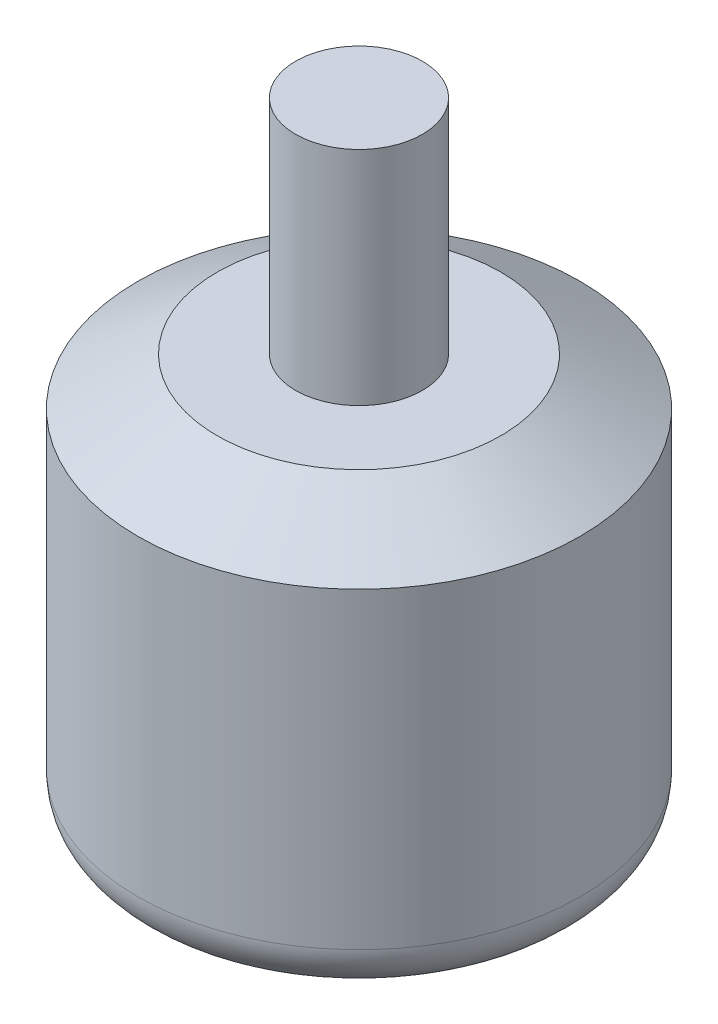
ISO-10303-21;
HEADER;
FILE_DESCRIPTION(('STEP AP214'),'2;1');
FILE_NAME('part.step','',(''),(''),'','','');
FILE_SCHEMA(('AUTOMOTIVE_DESIGN { 1 0 10303 214 1 1 1 1 }'));
ENDSEC;
DATA;
#1=APPLICATION_CONTEXT('core data for automotive mechanical design processes');
#2=APPLICATION_PROTOCOL_DEFINITION('international standard','automotive_design',2000,#1);
#3=PRODUCT_CONTEXT('',#1,'mechanical');
#4=PRODUCT('Part','Part','',(#3));
#5=PRODUCT_RELATED_PRODUCT_CATEGORY('part','',(#4));
#6=PRODUCT_DEFINITION_FORMATION('','',#4);
#7=PRODUCT_DEFINITION_CONTEXT('part definition',#1,'design');
#8=PRODUCT_DEFINITION('design','',#6,#7);
#9=PRODUCT_DEFINITION_SHAPE('','',#8);
#10=(LENGTH_UNIT() NAMED_UNIT(*) SI_UNIT(.MILLI.,.METRE.));
#11=(NAMED_UNIT(*) PLANE_ANGLE_UNIT() SI_UNIT($,.RADIAN.));
#12=(NAMED_UNIT(*) SI_UNIT($,.STERADIAN.) SOLID_ANGLE_UNIT());
#13=UNCERTAINTY_MEASURE_WITH_UNIT(LENGTH_MEASURE(1.E-05),#10,'distance_accuracy_value','');
#14=(GEOMETRIC_REPRESENTATION_CONTEXT(3) GLOBAL_UNCERTAINTY_ASSIGNED_CONTEXT((#13)) GLOBAL_UNIT_ASSIGNED_CONTEXT((#10,
#11,#12)) REPRESENTATION_CONTEXT('',''));
#15=CARTESIAN_POINT('',(0.,0.,0.));
#16=DIRECTION('',(0.,0.,1.));
#17=DIRECTION('',(1.,0.,0.));
#18=AXIS2_PLACEMENT_3D('',#15,#16,#17);
#19=CARTESIAN_POINT('',(0.,25.7,0.));
#20=DIRECTION('',(0.,-1.,0.));
#21=DIRECTION('',(0.,0.,-1.));
#22=AXIS2_PLACEMENT_3D('',#19,#20,#21);
#23=CYLINDRICAL_SURFACE('',#22,13.95);
#24=CARTESIAN_POINT('',(0.,3.,0.));
#25=DIRECTION('',(0.,1.,0.));
#26=DIRECTION('',(0.,0.,1.));
#27=AXIS2_PLACEMENT_3D('',#24,#25,#26);
#28=CIRCLE('',#27,13.95);
#29=CARTESIAN_POINT('',(0.,2.99999999999999,-13.95));
#30=VERTEX_POINT('',#29);
#31=EDGE_CURVE('E106',#30,#30,#28,.T.);
#32=CARTESIAN_POINT('',(0.,22.7,0.));
#33=DIRECTION('',(0.,1.,0.));
#34=DIRECTION('',(0.,0.,1.));
#35=AXIS2_PLACEMENT_3D('',#32,#33,#34);
#36=CIRCLE('',#35,13.95);
#37=CARTESIAN_POINT('',(0.,22.7,-13.95));
#38=VERTEX_POINT('',#37);
#39=EDGE_CURVE('E103',#38,#38,#36,.F.);
#40=CARTESIAN_POINT('',(0.,2.99999999999999,-13.95));
#41=CARTESIAN_POINT('',(0.,3.20520833333333,-13.95));
#42=CARTESIAN_POINT('',(0.,3.41041666666666,-13.95));
#43=CARTESIAN_POINT('',(0.,3.82083333333333,-13.95));
#44=CARTESIAN_POINT('',(0.,4.02604166666666,-13.95));
#45=CARTESIAN_POINT('',(0.,4.43645833333333,-13.95));
#46=CARTESIAN_POINT('',(0.,4.64166666666666,-13.95));
#47=CARTESIAN_POINT('',(0.,5.05208333333333,-13.95));
#48=CARTESIAN_POINT('',(0.,5.25729166666666,-13.95));
#49=CARTESIAN_POINT('',(0.,5.66770833333333,-13.95));
#50=CARTESIAN_POINT('',(0.,5.87291666666666,-13.95));
#51=CARTESIAN_POINT('',(0.,6.28333333333333,-13.95));
#52=CARTESIAN_POINT('',(0.,6.48854166666666,-13.95));
#53=CARTESIAN_POINT('',(0.,6.89895833333333,-13.95));
#54=CARTESIAN_POINT('',(0.,7.10416666666666,-13.95));
#55=CARTESIAN_POINT('',(0.,7.51458333333333,-13.95));
#56=CARTESIAN_POINT('',(0.,7.71979166666666,-13.95));
#57=CARTESIAN_POINT('',(0.,8.13020833333333,-13.95));
#58=CARTESIAN_POINT('',(0.,8.33541666666666,-13.95));
#59=CARTESIAN_POINT('',(0.,8.74583333333333,-13.95));
#60=CARTESIAN_POINT('',(0.,8.95104166666667,-13.95));
#61=CARTESIAN_POINT('',(0.,9.36145833333333,-13.95));
#62=CARTESIAN_POINT('',(0.,9.56666666666666,-13.95));
#63=CARTESIAN_POINT('',(0.,9.97708333333333,-13.95));
#64=CARTESIAN_POINT('',(0.,10.1822916666667,-13.95));
#65=CARTESIAN_POINT('',(0.,10.5927083333333,-13.95));
#66=CARTESIAN_POINT('',(0.,10.7979166666667,-13.95));
#67=CARTESIAN_POINT('',(0.,11.2083333333333,-13.95));
#68=CARTESIAN_POINT('',(0.,11.4135416666667,-13.95));
#69=CARTESIAN_POINT('',(0.,11.8239583333333,-13.95));
#70=CARTESIAN_POINT('',(0.,12.0291666666667,-13.95));
#71=CARTESIAN_POINT('',(0.,12.4395833333333,-13.95));
#72=CARTESIAN_POINT('',(0.,12.6447916666667,-13.95));
#73=CARTESIAN_POINT('',(0.,13.0552083333333,-13.95));
#74=CARTESIAN_POINT('',(0.,13.2604166666667,-13.95));
#75=CARTESIAN_POINT('',(0.,13.6708333333333,-13.95));
#76=CARTESIAN_POINT('',(0.,13.8760416666667,-13.95));
#77=CARTESIAN_POINT('',(0.,14.2864583333333,-13.95));
#78=CARTESIAN_POINT('',(0.,14.4916666666667,-13.95));
#79=CARTESIAN_POINT('',(0.,14.9020833333333,-13.95));
#80=CARTESIAN_POINT('',(0.,15.1072916666667,-13.95));
#81=CARTESIAN_POINT('',(0.,15.5177083333333,-13.95));
#82=CARTESIAN_POINT('',(0.,15.7229166666667,-13.95));
#83=CARTESIAN_POINT('',(0.,16.1333333333333,-13.95));
#84=CARTESIAN_POINT('',(0.,16.3385416666667,-13.95));
#85=CARTESIAN_POINT('',(0.,16.7489583333333,-13.95));
#86=CARTESIAN_POINT('',(0.,16.9541666666667,-13.95));
#87=CARTESIAN_POINT('',(0.,17.3645833333333,-13.95));
#88=CARTESIAN_POINT('',(0.,17.5697916666667,-13.95));
#89=CARTESIAN_POINT('',(0.,17.9802083333333,-13.95));
#90=CARTESIAN_POINT('',(0.,18.1854166666667,-13.95));
#91=CARTESIAN_POINT('',(0.,18.5958333333333,-13.95));
#92=CARTESIAN_POINT('',(0.,18.8010416666667,-13.95));
#93=CARTESIAN_POINT('',(0.,19.2114583333333,-13.95));
#94=CARTESIAN_POINT('',(0.,19.4166666666667,-13.95));
#95=CARTESIAN_POINT('',(0.,19.8270833333333,-13.95));
#96=CARTESIAN_POINT('',(0.,20.0322916666667,-13.95));
#97=CARTESIAN_POINT('',(0.,20.4427083333333,-13.95));
#98=CARTESIAN_POINT('',(0.,20.6479166666667,-13.95));
#99=CARTESIAN_POINT('',(0.,21.0583333333333,-13.95));
#100=CARTESIAN_POINT('',(0.,21.2635416666667,-13.95));
#101=CARTESIAN_POINT('',(0.,21.6739583333333,-13.95));
#102=CARTESIAN_POINT('',(0.,21.8791666666667,-13.95));
#103=CARTESIAN_POINT('',(0.,22.2895833333333,-13.95));
#104=CARTESIAN_POINT('',(0.,22.4947916666667,-13.95));
#105=CARTESIAN_POINT('',(0.,22.7,-13.95));
#106=B_SPLINE_CURVE_WITH_KNOTS('',3,(#40,#41,#42,#43,#44,#45,#46,#47,#48,#49,#50,#51,#52,#53,
#54,#55,#56,#57,#58,#59,#60,#61,#62,#63,#64,#65,#66,#67,#68,#69,#70,#71,#72,#73,#74,#75,#76,#77,
#78,#79,#80,#81,#82,#83,#84,#85,#86,#87,#88,#89,#90,#91,#92,#93,#94,#95,#96,#97,#98,#99,#100,
#101,#102,#103,#104,#105),.UNSPECIFIED.,.F.,.F.,(4,2,2,2,2,2,2,2,2,2,2,2,2,2,2,2,2,2,2,2,2,2,2,
2,2,2,2,2,2,2,2,2,4),(0.,0.615625000000002,1.23125,1.846875,2.4625,3.078125,3.69375,4.309375,
4.92500000000001,5.540625,6.15625000000001,6.771875,7.3875,8.003125,8.61875000000001,
9.23437500000001,9.85000000000001,10.465625,11.08125,11.696875,12.3125,12.928125,13.54375,
14.159375,14.775,15.390625,16.00625,16.621875,17.2375,17.853125,18.46875,19.084375,19.7),.UNSPECIFIED.);
#107=EDGE_CURVE('BSEAM38',#30,#38,#106,.T.);
#108=ORIENTED_EDGE('',*,*,#31,.T.);
#109=ORIENTED_EDGE('',*,*,#39,.T.);
#110=ORIENTED_EDGE('',*,*,#107,.T.);
#111=ORIENTED_EDGE('',*,*,#107,.F.);
#112=EDGE_LOOP('',(#108,#110,#109,#111));
#113=FACE_BOUND('',#112,.T.);
#114=ADVANCED_FACE('F38',(#113),#23,.T.);
#115=CARTESIAN_POINT('',(0.,25.7,0.));
#116=DIRECTION('',(0.,1.,0.));
#117=DIRECTION('',(0.,0.,1.));
#118=AXIS2_PLACEMENT_3D('',#115,#116,#117);
#119=PLANE('',#118);
#120=CARTESIAN_POINT('',(0.,25.7,0.));
#121=DIRECTION('',(0.,1.,0.));
#122=DIRECTION('',(0.,0.,1.));
#123=AXIS2_PLACEMENT_3D('',#120,#121,#122);
#124=CIRCLE('',#123,4.);
#125=CARTESIAN_POINT('',(0.,25.7,4.));
#126=VERTEX_POINT('',#125);
#127=EDGE_CURVE('E94',#126,#126,#124,.T.);
#128=ORIENTED_EDGE('',*,*,#127,.F.);
#129=EDGE_LOOP('',(#128));
#130=FACE_BOUND('',#129,.T.);
#131=CARTESIAN_POINT('',(0.,25.7,0.));
#132=DIRECTION('',(0.,1.,0.));
#133=DIRECTION('',(0.,0.,1.));
#134=AXIS2_PLACEMENT_3D('',#131,#132,#133);
#135=CIRCLE('',#134,8.94999999999999);
#136=CARTESIAN_POINT('',(0.,25.7,-8.95));
#137=VERTEX_POINT('',#136);
#138=EDGE_CURVE('E98',#137,#137,#135,.T.);
#139=ORIENTED_EDGE('',*,*,#138,.T.);
#140=EDGE_LOOP('',(#139));
#141=FACE_BOUND('',#140,.T.);
#142=ADVANCED_FACE('F121',(#130,#141),#119,.T.);
#143=CARTESIAN_POINT('',(0.,0.,0.));
#144=DIRECTION('',(0.,1.,0.));
#145=DIRECTION('',(0.,0.,1.));
#146=AXIS2_PLACEMENT_3D('',#143,#144,#145);
#147=PLANE('',#146);
#148=CARTESIAN_POINT('',(0.,0.,0.));
#149=DIRECTION('',(0.,1.,0.));
#150=DIRECTION('',(0.,0.,1.));
#151=AXIS2_PLACEMENT_3D('',#148,#149,#150);
#152=CIRCLE('',#151,3.);
#153=CARTESIAN_POINT('',(0.,0.,3.));
#154=VERTEX_POINT('',#153);
#155=EDGE_CURVE('E11',#154,#154,#152,.F.);
#156=ORIENTED_EDGE('',*,*,#155,.F.);
#157=EDGE_LOOP('',(#156));
#158=FACE_BOUND('',#157,.T.);
#159=CARTESIAN_POINT('',(0.,0.,0.));
#160=DIRECTION('',(0.,1.,0.));
#161=DIRECTION('',(0.,0.,1.));
#162=AXIS2_PLACEMENT_3D('',#159,#160,#161);
#163=CIRCLE('',#162,10.95);
#164=CARTESIAN_POINT('',(0.,0.,10.95));
#165=VERTEX_POINT('',#164);
#166=EDGE_CURVE('E46',#165,#165,#163,.F.);
#167=ORIENTED_EDGE('',*,*,#166,.T.);
#168=EDGE_LOOP('',(#167));
#169=FACE_BOUND('',#168,.T.);
#170=CARTESIAN_POINT('',(0.,0.,-8.));
#171=DIRECTION('',(0.,-1.,0.));
#172=DIRECTION('',(0.,0.,-1.));
#173=AXIS2_PLACEMENT_3D('',#170,#171,#172);
#174=CIRCLE('',#173,1.24999999999999);
#175=CARTESIAN_POINT('',(0.,0.,-9.24999999999999));
#176=VERTEX_POINT('',#175);
#177=EDGE_CURVE('E70',#176,#176,#174,.T.);
#178=ORIENTED_EDGE('',*,*,#177,.F.);
#179=EDGE_LOOP('',(#178));
#180=FACE_BOUND('',#179,.T.);
#181=CARTESIAN_POINT('',(0.,0.,8.));
#182=DIRECTION('',(0.,-1.,0.));
#183=DIRECTION('',(0.,0.,-1.));
#184=AXIS2_PLACEMENT_3D('',#181,#182,#183);
#185=CIRCLE('',#184,1.24999999999999);
#186=CARTESIAN_POINT('',(0.,0.,6.75000000000001));
#187=VERTEX_POINT('',#186);
#188=EDGE_CURVE('E69',#187,#187,#185,.T.);
#189=ORIENTED_EDGE('',*,*,#188,.F.);
#190=EDGE_LOOP('',(#189));
#191=FACE_BOUND('',#190,.T.);
#192=CARTESIAN_POINT('',(9.5,0.,0.));
#193=DIRECTION('',(0.,-1.,0.));
#194=DIRECTION('',(0.,0.,-1.));
#195=AXIS2_PLACEMENT_3D('',#192,#193,#194);
#196=CIRCLE('',#195,1.24999999999999);
#197=CARTESIAN_POINT('',(9.5,0.,-1.24999999999999));
#198=VERTEX_POINT('',#197);
#199=EDGE_CURVE('E82',#198,#198,#196,.T.);
#200=ORIENTED_EDGE('',*,*,#199,.F.);
#201=EDGE_LOOP('',(#200));
#202=FACE_BOUND('',#201,.T.);
#203=CARTESIAN_POINT('',(-9.5,0.,0.));
#204=DIRECTION('',(0.,-1.,0.));
#205=DIRECTION('',(0.,0.,-1.));
#206=AXIS2_PLACEMENT_3D('',#203,#204,#205);
#207=CIRCLE('',#206,1.24999999999999);
#208=CARTESIAN_POINT('',(-9.5,0.,-1.24999999999999));
#209=VERTEX_POINT('',#208);
#210=EDGE_CURVE('E88',#209,#209,#207,.T.);
#211=ORIENTED_EDGE('',*,*,#210,.F.);
#212=EDGE_LOOP('',(#211));
#213=FACE_BOUND('',#212,.T.);
#214=ADVANCED_FACE('F111',(#158,#169,#180,#191,#202,#213),#147,.F.);
#215=CARTESIAN_POINT('',(0.,25.7,0.));
#216=DIRECTION('',(0.,-1.,0.));
#217=DIRECTION('',(0.,0.,-1.));
#218=AXIS2_PLACEMENT_3D('',#215,#216,#217);
#219=CONICAL_SURFACE('',#218,8.94999999999999,1.03037682652431);
#220=CARTESIAN_POINT('',(0.,22.7,-13.95));
#221=CARTESIAN_POINT('',(0.,22.73125,-13.8979166666667));
#222=CARTESIAN_POINT('',(0.,22.7625,-13.8458333333333));
#223=CARTESIAN_POINT('',(0.,22.825,-13.7416666666667));
#224=CARTESIAN_POINT('',(0.,22.85625,-13.6895833333333));
#225=CARTESIAN_POINT('',(0.,22.91875,-13.5854166666667));
#226=CARTESIAN_POINT('',(0.,22.95,-13.5333333333333));
#227=CARTESIAN_POINT('',(0.,23.0125,-13.4291666666667));
#228=CARTESIAN_POINT('',(0.,23.04375,-13.3770833333333));
#229=CARTESIAN_POINT('',(0.,23.10625,-13.2729166666667));
#230=CARTESIAN_POINT('',(0.,23.1375,-13.2208333333333));
#231=CARTESIAN_POINT('',(0.,23.2,-13.1166666666667));
#232=CARTESIAN_POINT('',(0.,23.23125,-13.0645833333333));
#233=CARTESIAN_POINT('',(0.,23.29375,-12.9604166666667));
#234=CARTESIAN_POINT('',(0.,23.325,-12.9083333333333));
#235=CARTESIAN_POINT('',(0.,23.3875,-12.8041666666667));
#236=CARTESIAN_POINT('',(0.,23.41875,-12.7520833333333));
#237=CARTESIAN_POINT('',(0.,23.48125,-12.6479166666667));
#238=CARTESIAN_POINT('',(0.,23.5125,-12.5958333333333));
#239=CARTESIAN_POINT('',(0.,23.575,-12.4916666666667));
#240=CARTESIAN_POINT('',(0.,23.60625,-12.4395833333333));
#241=CARTESIAN_POINT('',(0.,23.66875,-12.3354166666667));
#242=CARTESIAN_POINT('',(0.,23.7,-12.2833333333333));
#243=CARTESIAN_POINT('',(0.,23.7625,-12.1791666666667));
#244=CARTESIAN_POINT('',(0.,23.79375,-12.1270833333333));
#245=CARTESIAN_POINT('',(0.,23.85625,-12.0229166666667));
#246=CARTESIAN_POINT('',(0.,23.8875,-11.9708333333333));
#247=CARTESIAN_POINT('',(0.,23.95,-11.8666666666667));
#248=CARTESIAN_POINT('',(0.,23.98125,-11.8145833333333));
#249=CARTESIAN_POINT('',(0.,24.04375,-11.7104166666667));
#250=CARTESIAN_POINT('',(0.,24.075,-11.6583333333333));
#251=CARTESIAN_POINT('',(0.,24.1375,-11.5541666666667));
#252=CARTESIAN_POINT('',(0.,24.16875,-11.5020833333333));
#253=CARTESIAN_POINT('',(0.,24.23125,-11.3979166666667));
#254=CARTESIAN_POINT('',(0.,24.2625,-11.3458333333333));
#255=CARTESIAN_POINT('',(0.,24.325,-11.2416666666667));
#256=CARTESIAN_POINT('',(0.,24.35625,-11.1895833333333));
#257=CARTESIAN_POINT('',(0.,24.41875,-11.0854166666667));
#258=CARTESIAN_POINT('',(0.,24.45,-11.0333333333333));
#259=CARTESIAN_POINT('',(0.,24.5125,-10.9291666666667));
#260=CARTESIAN_POINT('',(0.,24.54375,-10.8770833333333));
#261=CARTESIAN_POINT('',(0.,24.60625,-10.7729166666667));
#262=CARTESIAN_POINT('',(0.,24.6375,-10.7208333333333));
#263=CARTESIAN_POINT('',(0.,24.7,-10.6166666666667));
#264=CARTESIAN_POINT('',(0.,24.73125,-10.5645833333333));
#265=CARTESIAN_POINT('',(0.,24.79375,-10.4604166666667));
#266=CARTESIAN_POINT('',(0.,24.825,-10.4083333333333));
#267=CARTESIAN_POINT('',(0.,24.8875,-10.3041666666667));
#268=CARTESIAN_POINT('',(0.,24.91875,-10.2520833333333));
#269=CARTESIAN_POINT('',(0.,24.98125,-10.1479166666667));
#270=CARTESIAN_POINT('',(0.,25.0125,-10.0958333333333));
#271=CARTESIAN_POINT('',(0.,25.075,-9.99166666666666));
#272=CARTESIAN_POINT('',(0.,25.10625,-9.93958333333333));
#273=CARTESIAN_POINT('',(0.,25.16875,-9.83541666666666));
#274=CARTESIAN_POINT('',(0.,25.2,-9.78333333333333));
#275=CARTESIAN_POINT('',(0.,25.2625,-9.67916666666666));
#276=CARTESIAN_POINT('',(0.,25.29375,-9.62708333333333));
#277=CARTESIAN_POINT('',(0.,25.35625,-9.52291666666666));
#278=CARTESIAN_POINT('',(0.,25.3875,-9.47083333333333));
#279=CARTESIAN_POINT('',(0.,25.45,-9.36666666666666));
#280=CARTESIAN_POINT('',(0.,25.48125,-9.31458333333333));
#281=CARTESIAN_POINT('',(0.,25.54375,-9.21041666666666));
#282=CARTESIAN_POINT('',(0.,25.575,-9.15833333333333));
#283=CARTESIAN_POINT('',(0.,25.6375,-9.05416666666666));
#284=CARTESIAN_POINT('',(0.,25.66875,-9.00208333333333));
#285=CARTESIAN_POINT('',(0.,25.7,-8.95));
#286=B_SPLINE_CURVE_WITH_KNOTS('',3,(#220,#221,#222,#223,#224,#225,#226,#227,#228,#229,#230,
#231,#232,#233,#234,#235,#236,#237,#238,#239,#240,#241,#242,#243,#244,#245,#246,#247,#248,#249,
#250,#251,#252,#253,#254,#255,#256,#257,#258,#259,#260,#261,#262,#263,#264,#265,#266,#267,#268,
#269,#270,#271,#272,#273,#274,#275,#276,#277,#278,#279,#280,#281,#282,#283,#284,#285),
.UNSPECIFIED.,.F.,.F.,(4,2,2,2,2,2,2,2,2,2,2,2,2,2,2,2,2,2,2,2,2,2,2,2,2,2,2,2,2,2,2,2,4),(0.,
0.182217246713916,0.36443449342783,0.546651740141746,0.728868986855661,0.911086233569577,
1.09330348028349,1.27552072699741,1.45773797371132,1.63995522042524,1.82217246713916,
2.00438971385307,2.18660696056699,2.3688242072809,2.55104145399482,2.73325870070873,
2.91547594742265,3.09769319413657,3.27991044085048,3.4621276875644,3.64434493427831,
3.82656218099223,4.00877942770615,4.19099667442006,4.37321392113398,4.55543116784789,
4.73764841456181,4.91986566127572,5.10208290798964,5.28430015470355,5.46651740141747,
5.64873464813139,5.8309518948453),.UNSPECIFIED.);
#287=EDGE_CURVE('BSEAM125',#38,#137,#286,.T.);
#288=ORIENTED_EDGE('',*,*,#39,.F.);
#289=ORIENTED_EDGE('',*,*,#138,.F.);
#290=ORIENTED_EDGE('',*,*,#287,.T.);
#291=ORIENTED_EDGE('',*,*,#287,.F.);
#292=EDGE_LOOP('',(#288,#290,#289,#291));
#293=FACE_BOUND('',#292,.T.);
#294=ADVANCED_FACE('F125',(#293),#219,.T.);
#295=CARTESIAN_POINT('',(0.,39.7,0.));
#296=DIRECTION('',(0.,-1.,0.));
#297=DIRECTION('',(0.,0.,-1.));
#298=AXIS2_PLACEMENT_3D('',#295,#296,#297);
#299=CYLINDRICAL_SURFACE('',#298,4.);
#300=CARTESIAN_POINT('',(0.,39.7,0.));
#301=DIRECTION('',(0.,1.,0.));
#302=DIRECTION('',(0.,0.,1.));
#303=AXIS2_PLACEMENT_3D('',#300,#301,#302);
#304=CIRCLE('',#303,4.);
#305=CARTESIAN_POINT('',(0.,39.7,4.));
#306=VERTEX_POINT('',#305);
#307=EDGE_CURVE('E95',#306,#306,#304,.T.);
#308=ORIENTED_EDGE('',*,*,#307,.F.);
#309=EDGE_LOOP('',(#308));
#310=FACE_BOUND('',#309,.T.);
#311=ORIENTED_EDGE('',*,*,#127,.T.);
#312=EDGE_LOOP('',(#311));
#313=FACE_BOUND('',#312,.T.);
#314=ADVANCED_FACE('F128',(#310,#313),#299,.T.);
#315=CARTESIAN_POINT('',(0.,39.7,0.));
#316=DIRECTION('',(0.,1.,0.));
#317=DIRECTION('',(0.,0.,1.));
#318=AXIS2_PLACEMENT_3D('',#315,#316,#317);
#319=PLANE('',#318);
#320=ORIENTED_EDGE('',*,*,#307,.T.);
#321=EDGE_LOOP('',(#320));
#322=FACE_BOUND('',#321,.T.);
#323=ADVANCED_FACE('F143',(#322),#319,.T.);
#324=CARTESIAN_POINT('',(-9.5,7.50000000000001,0.));
#325=DIRECTION('',(0.,-1.,0.));
#326=DIRECTION('',(0.,0.,-1.));
#327=AXIS2_PLACEMENT_3D('',#324,#325,#326);
#328=CONICAL_SURFACE('',#327,1.24999999999999,1.02974425867665);
#329=CARTESIAN_POINT('',(-9.5,8.25107577378445,0.));
#330=VERTEX_POINT('',#329);
#331=VERTEX_LOOP('',#330);
#332=FACE_BOUND('',#331,.T.);
#333=CARTESIAN_POINT('',(-9.5,7.50000000000001,0.));
#334=DIRECTION('',(0.,-1.,0.));
#335=DIRECTION('',(0.,0.,-1.));
#336=AXIS2_PLACEMENT_3D('',#333,#334,#335);
#337=CIRCLE('',#336,1.24999999999999);
#338=CARTESIAN_POINT('',(-9.5,7.50000000000001,-1.24999999999999));
#339=VERTEX_POINT('',#338);
#340=EDGE_CURVE('E91',#339,#339,#337,.T.);
#341=ORIENTED_EDGE('',*,*,#340,.T.);
#342=EDGE_LOOP('',(#341));
#343=FACE_BOUND('',#342,.T.);
#344=ADVANCED_FACE('F147',(#332,#343),#328,.F.);
#345=CARTESIAN_POINT('',(-9.5,0.,0.));
#346=DIRECTION('',(0.,-1.,0.));
#347=DIRECTION('',(0.,0.,-1.));
#348=AXIS2_PLACEMENT_3D('',#345,#346,#347);
#349=CYLINDRICAL_SURFACE('',#348,1.24999999999999);
#350=ORIENTED_EDGE('',*,*,#340,.F.);
#351=EDGE_LOOP('',(#350));
#352=FACE_BOUND('',#351,.T.);
#353=ORIENTED_EDGE('',*,*,#210,.T.);
#354=EDGE_LOOP('',(#353));
#355=FACE_BOUND('',#354,.T.);
#356=ADVANCED_FACE('F151',(#352,#355),#349,.F.);
#357=CARTESIAN_POINT('',(9.5,7.50000000000001,0.));
#358=DIRECTION('',(0.,-1.,0.));
#359=DIRECTION('',(0.,0.,-1.));
#360=AXIS2_PLACEMENT_3D('',#357,#358,#359);
#361=CONICAL_SURFACE('',#360,1.24999999999999,1.02974425867665);
#362=CARTESIAN_POINT('',(9.5,8.25107577378445,0.));
#363=VERTEX_POINT('',#362);
#364=VERTEX_LOOP('',#363);
#365=FACE_BOUND('',#364,.T.);
#366=CARTESIAN_POINT('',(9.5,7.50000000000001,0.));
#367=DIRECTION('',(0.,-1.,0.));
#368=DIRECTION('',(0.,0.,-1.));
#369=AXIS2_PLACEMENT_3D('',#366,#367,#368);
#370=CIRCLE('',#369,1.24999999999999);
#371=CARTESIAN_POINT('',(9.5,7.50000000000001,-1.24999999999999));
#372=VERTEX_POINT('',#371);
#373=EDGE_CURVE('E85',#372,#372,#370,.T.);
#374=ORIENTED_EDGE('',*,*,#373,.T.);
#375=EDGE_LOOP('',(#374));
#376=FACE_BOUND('',#375,.T.);
#377=ADVANCED_FACE('F154',(#365,#376),#361,.F.);
#378=CARTESIAN_POINT('',(9.5,0.,0.));
#379=DIRECTION('',(0.,-1.,0.));
#380=DIRECTION('',(0.,0.,-1.));
#381=AXIS2_PLACEMENT_3D('',#378,#379,#380);
#382=CYLINDRICAL_SURFACE('',#381,1.24999999999999);
#383=ORIENTED_EDGE('',*,*,#373,.F.);
#384=EDGE_LOOP('',(#383));
#385=FACE_BOUND('',#384,.T.);
#386=ORIENTED_EDGE('',*,*,#199,.T.);
#387=EDGE_LOOP('',(#386));
#388=FACE_BOUND('',#387,.T.);
#389=ADVANCED_FACE('F158',(#385,#388),#382,.F.);
#390=CARTESIAN_POINT('',(0.,7.50000000000001,8.));
#391=DIRECTION('',(0.,-1.,0.));
#392=DIRECTION('',(0.,0.,-1.));
#393=AXIS2_PLACEMENT_3D('',#390,#391,#392);
#394=CONICAL_SURFACE('',#393,1.24999999999999,1.02974425867665);
#395=CARTESIAN_POINT('',(0.,8.25107577378445,8.));
#396=VERTEX_POINT('',#395);
#397=VERTEX_LOOP('',#396);
#398=FACE_BOUND('',#397,.T.);
#399=CARTESIAN_POINT('',(0.,7.50000000000001,8.));
#400=DIRECTION('',(0.,-1.,0.));
#401=DIRECTION('',(0.,0.,-1.));
#402=AXIS2_PLACEMENT_3D('',#399,#400,#401);
#403=CIRCLE('',#402,1.24999999999999);
#404=CARTESIAN_POINT('',(0.,7.50000000000001,6.75000000000001));
#405=VERTEX_POINT('',#404);
#406=EDGE_CURVE('E73',#405,#405,#403,.T.);
#407=ORIENTED_EDGE('',*,*,#406,.T.);
#408=EDGE_LOOP('',(#407));
#409=FACE_BOUND('',#408,.T.);
#410=ADVANCED_FACE('F161',(#398,#409),#394,.F.);
#411=CARTESIAN_POINT('',(0.,0.,8.));
#412=DIRECTION('',(0.,-1.,0.));
#413=DIRECTION('',(0.,0.,-1.));
#414=AXIS2_PLACEMENT_3D('',#411,#412,#413);
#415=CYLINDRICAL_SURFACE('',#414,1.24999999999999);
#416=ORIENTED_EDGE('',*,*,#406,.F.);
#417=EDGE_LOOP('',(#416));
#418=FACE_BOUND('',#417,.T.);
#419=ORIENTED_EDGE('',*,*,#188,.T.);
#420=EDGE_LOOP('',(#419));
#421=FACE_BOUND('',#420,.T.);
#422=ADVANCED_FACE('F63',(#418,#421),#415,.F.);
#423=CARTESIAN_POINT('',(0.,7.50000000000001,-8.));
#424=DIRECTION('',(0.,-1.,0.));
#425=DIRECTION('',(0.,0.,-1.));
#426=AXIS2_PLACEMENT_3D('',#423,#424,#425);
#427=CONICAL_SURFACE('',#426,1.24999999999999,1.02974425867665);
#428=CARTESIAN_POINT('',(0.,8.25107577378445,-8.));
#429=VERTEX_POINT('',#428);
#430=VERTEX_LOOP('',#429);
#431=FACE_BOUND('',#430,.T.);
#432=CARTESIAN_POINT('',(0.,7.50000000000001,-8.));
#433=DIRECTION('',(0.,-1.,0.));
#434=DIRECTION('',(0.,0.,-1.));
#435=AXIS2_PLACEMENT_3D('',#432,#433,#434);
#436=CIRCLE('',#435,1.24999999999999);
#437=CARTESIAN_POINT('',(0.,7.50000000000001,-9.24999999999999));
#438=VERTEX_POINT('',#437);
#439=EDGE_CURVE('E67',#438,#438,#436,.T.);
#440=ORIENTED_EDGE('',*,*,#439,.T.);
#441=EDGE_LOOP('',(#440));
#442=FACE_BOUND('',#441,.T.);
#443=ADVANCED_FACE('F59',(#431,#442),#427,.F.);
#444=CARTESIAN_POINT('',(0.,0.,-8.));
#445=DIRECTION('',(0.,-1.,0.));
#446=DIRECTION('',(0.,0.,-1.));
#447=AXIS2_PLACEMENT_3D('',#444,#445,#446);
#448=CYLINDRICAL_SURFACE('',#447,1.24999999999999);
#449=ORIENTED_EDGE('',*,*,#439,.F.);
#450=EDGE_LOOP('',(#449));
#451=FACE_BOUND('',#450,.T.);
#452=ORIENTED_EDGE('',*,*,#177,.T.);
#453=EDGE_LOOP('',(#452));
#454=FACE_BOUND('',#453,.T.);
#455=ADVANCED_FACE('F62',(#451,#454),#448,.F.);
#456=CARTESIAN_POINT('',(0.,3.,0.));
#457=DIRECTION('',(0.,1.,0.));
#458=DIRECTION('',(0.,0.,1.));
#459=AXIS2_PLACEMENT_3D('',#456,#457,#458);
#460=TOROIDAL_SURFACE('',#459,10.95,3.);
#461=ORIENTED_EDGE('',*,*,#166,.F.);
#462=EDGE_LOOP('',(#461));
#463=FACE_BOUND('',#462,.T.);
#464=ORIENTED_EDGE('',*,*,#31,.F.);
#465=EDGE_LOOP('',(#464));
#466=FACE_BOUND('',#465,.T.);
#467=ADVANCED_FACE('F40',(#463,#466),#460,.T.);
#468=CARTESIAN_POINT('',(0.,-2.5,0.));
#469=DIRECTION('',(0.,1.,0.));
#470=DIRECTION('',(0.,0.,1.));
#471=AXIS2_PLACEMENT_3D('',#468,#469,#470);
#472=CYLINDRICAL_SURFACE('',#471,3.);
#473=CARTESIAN_POINT('',(0.,-2.5,0.));
#474=DIRECTION('',(0.,-1.,0.));
#475=DIRECTION('',(0.,0.,-1.));
#476=AXIS2_PLACEMENT_3D('',#473,#474,#475);
#477=CIRCLE('',#476,3.);
#478=CARTESIAN_POINT('',(0.,-2.5,-3.));
#479=VERTEX_POINT('',#478);
#480=EDGE_CURVE('E76',#479,#479,#477,.T.);
#481=ORIENTED_EDGE('',*,*,#480,.F.);
#482=EDGE_LOOP('',(#481));
#483=FACE_BOUND('',#482,.T.);
#484=ORIENTED_EDGE('',*,*,#155,.T.);
#485=EDGE_LOOP('',(#484));
#486=FACE_BOUND('',#485,.T.);
#487=ADVANCED_FACE('F116',(#483,#486),#472,.T.);
#488=CARTESIAN_POINT('',(0.,-2.5,0.));
#489=DIRECTION('',(0.,-1.,0.));
#490=DIRECTION('',(0.,0.,-1.));
#491=AXIS2_PLACEMENT_3D('',#488,#489,#490);
#492=PLANE('',#491);
#493=ORIENTED_EDGE('',*,*,#480,.T.);
#494=EDGE_LOOP('',(#493));
#495=FACE_BOUND('',#494,.T.);
#496=ADVANCED_FACE('F173',(#495),#492,.T.);
#497=CLOSED_SHELL('',(#114,#142,#214,#294,#314,#323,#344,#356,#377,#389,#410,#422,#443,#455,
#467,#487,#496));
#498=MANIFOLD_SOLID_BREP('B2',#497);
#499=ADVANCED_BREP_SHAPE_REPRESENTATION('',(#18,#498),#14);
#500=SHAPE_DEFINITION_REPRESENTATION(#9,#499);
ENDSEC;
END-ISO-10303-21;
